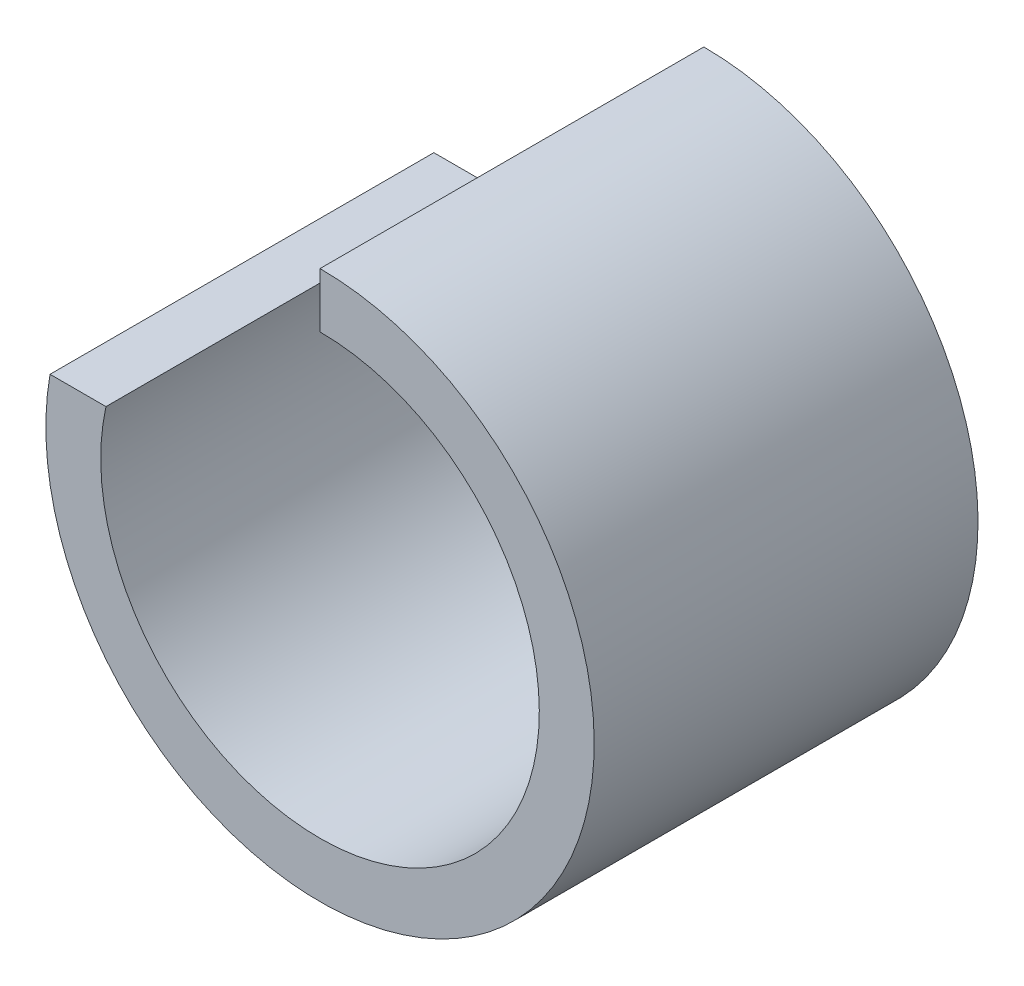
ISO-10303-21;
HEADER;
FILE_DESCRIPTION(('STEP AP214'),'2;1');
FILE_NAME('part.step','',(''),(''),'','','');
FILE_SCHEMA(('AUTOMOTIVE_DESIGN { 1 0 10303 214 1 1 1 1 }'));
ENDSEC;
DATA;
#1=APPLICATION_CONTEXT('core data for automotive mechanical design processes');
#2=APPLICATION_PROTOCOL_DEFINITION('international standard','automotive_design',2000,#1);
#3=PRODUCT_CONTEXT('',#1,'mechanical');
#4=PRODUCT('Part','Part','',(#3));
#5=PRODUCT_RELATED_PRODUCT_CATEGORY('part','',(#4));
#6=PRODUCT_DEFINITION_FORMATION('','',#4);
#7=PRODUCT_DEFINITION_CONTEXT('part definition',#1,'design');
#8=PRODUCT_DEFINITION('design','',#6,#7);
#9=PRODUCT_DEFINITION_SHAPE('','',#8);
#10=(LENGTH_UNIT() NAMED_UNIT(*) SI_UNIT(.MILLI.,.METRE.));
#11=(NAMED_UNIT(*) PLANE_ANGLE_UNIT() SI_UNIT($,.RADIAN.));
#12=(NAMED_UNIT(*) SI_UNIT($,.STERADIAN.) SOLID_ANGLE_UNIT());
#13=UNCERTAINTY_MEASURE_WITH_UNIT(LENGTH_MEASURE(1.E-05),#10,'distance_accuracy_value','');
#14=(GEOMETRIC_REPRESENTATION_CONTEXT(3) GLOBAL_UNCERTAINTY_ASSIGNED_CONTEXT((#13)) GLOBAL_UNIT_ASSIGNED_CONTEXT((#10,
#11,#12)) REPRESENTATION_CONTEXT('',''));
#15=CARTESIAN_POINT('',(0.,0.,0.));
#16=DIRECTION('',(0.,0.,1.));
#17=DIRECTION('',(1.,0.,0.));
#18=AXIS2_PLACEMENT_3D('',#15,#16,#17);
#19=CARTESIAN_POINT('',(0.,0.,14.));
#20=DIRECTION('',(0.,0.,-1.));
#21=DIRECTION('',(-1.,0.,0.));
#22=AXIS2_PLACEMENT_3D('',#19,#20,#21);
#23=CYLINDRICAL_SURFACE('',#22,7.99807242904795);
#24=CARTESIAN_POINT('',(0.,0.,0.));
#25=DIRECTION('',(0.,0.,-1.));
#26=DIRECTION('',(1.,0.,0.));
#27=AXIS2_PLACEMENT_3D('',#24,#25,#26);
#28=CIRCLE('',#27,7.99807242904795);
#29=CARTESIAN_POINT('',(0.,7.99807242904795,0.));
#30=VERTEX_POINT('',#29);
#31=CARTESIAN_POINT('',(-7.8072910551351,1.73648177666924,0.));
#32=VERTEX_POINT('',#31);
#33=EDGE_CURVE('E107',#30,#32,#28,.T.);
#34=ORIENTED_EDGE('',*,*,#33,.T.);
#35=DIRECTION('',(0.,0.,-1.));
#36=VECTOR('',#35,1.);
#37=CARTESIAN_POINT('',(-7.8072910551351,1.73648177666924,14.));
#38=LINE('',#37,#36);
#39=CARTESIAN_POINT('',(-7.8072910551351,1.73648177666924,14.));
#40=VERTEX_POINT('',#39);
#41=EDGE_CURVE('E11',#40,#32,#38,.T.);
#42=ORIENTED_EDGE('',*,*,#41,.F.);
#43=CARTESIAN_POINT('',(0.,0.,14.));
#44=DIRECTION('',(0.,0.,-1.));
#45=DIRECTION('',(1.,0.,0.));
#46=AXIS2_PLACEMENT_3D('',#43,#44,#45);
#47=CIRCLE('',#46,7.99807242904795);
#48=CARTESIAN_POINT('',(0.,7.99807242904795,14.));
#49=VERTEX_POINT('',#48);
#50=EDGE_CURVE('E91',#49,#40,#47,.T.);
#51=ORIENTED_EDGE('',*,*,#50,.F.);
#52=DIRECTION('',(0.,0.,-1.));
#53=VECTOR('',#52,1.);
#54=CARTESIAN_POINT('',(0.,7.99807242904795,14.));
#55=LINE('',#54,#53);
#56=EDGE_CURVE('E103',#49,#30,#55,.T.);
#57=ORIENTED_EDGE('',*,*,#56,.T.);
#58=EDGE_LOOP('',(#34,#42,#51,#57));
#59=FACE_BOUND('',#58,.T.);
#60=ADVANCED_FACE('F39',(#59),#23,.F.);
#61=CARTESIAN_POINT('',(-9.84807753012209,1.73648177666924,14.));
#62=DIRECTION('',(0.,-1.,0.));
#63=DIRECTION('',(0.,0.,-1.));
#64=AXIS2_PLACEMENT_3D('',#61,#62,#63);
#65=PLANE('',#64);
#66=DIRECTION('',(-1.,0.,0.));
#67=VECTOR('',#66,1.);
#68=CARTESIAN_POINT('',(-9.84807753012209,1.73648177666924,0.));
#69=LINE('',#68,#67);
#70=CARTESIAN_POINT('',(-9.84807753012209,1.73648177666924,0.));
#71=VERTEX_POINT('',#70);
#72=EDGE_CURVE('E96',#32,#71,#69,.T.);
#73=ORIENTED_EDGE('',*,*,#72,.T.);
#74=DIRECTION('',(0.,0.,-1.));
#75=VECTOR('',#74,1.);
#76=CARTESIAN_POINT('',(-9.84807753012209,1.73648177666924,14.));
#77=LINE('',#76,#75);
#78=CARTESIAN_POINT('',(-9.84807753012209,1.73648177666924,14.));
#79=VERTEX_POINT('',#78);
#80=EDGE_CURVE('E48',#79,#71,#77,.T.);
#81=ORIENTED_EDGE('',*,*,#80,.F.);
#82=DIRECTION('',(-1.,0.,0.));
#83=VECTOR('',#82,1.);
#84=CARTESIAN_POINT('',(-9.84807753012209,1.73648177666924,14.));
#85=LINE('',#84,#83);
#86=EDGE_CURVE('E86',#40,#79,#85,.T.);
#87=ORIENTED_EDGE('',*,*,#86,.F.);
#88=ORIENTED_EDGE('',*,*,#41,.T.);
#89=EDGE_LOOP('',(#73,#81,#87,#88));
#90=FACE_BOUND('',#89,.T.);
#91=ADVANCED_FACE('F95',(#90),#65,.F.);
#92=CARTESIAN_POINT('',(0.,0.,14.));
#93=DIRECTION('',(0.,0.,-1.));
#94=DIRECTION('',(-1.,0.,0.));
#95=AXIS2_PLACEMENT_3D('',#92,#93,#94);
#96=CYLINDRICAL_SURFACE('',#95,10.);
#97=CARTESIAN_POINT('',(0.,0.,0.));
#98=DIRECTION('',(0.,0.,1.));
#99=DIRECTION('',(1.,0.,0.));
#100=AXIS2_PLACEMENT_3D('',#97,#98,#99);
#101=CIRCLE('',#100,10.);
#102=CARTESIAN_POINT('',(0.,10.,0.));
#103=VERTEX_POINT('',#102);
#104=EDGE_CURVE('E73',#71,#103,#101,.T.);
#105=ORIENTED_EDGE('',*,*,#104,.T.);
#106=DIRECTION('',(0.,0.,-1.));
#107=VECTOR('',#106,1.);
#108=CARTESIAN_POINT('',(0.,10.,14.));
#109=LINE('',#108,#107);
#110=CARTESIAN_POINT('',(0.,10.,14.));
#111=VERTEX_POINT('',#110);
#112=EDGE_CURVE('E98',#111,#103,#109,.T.);
#113=ORIENTED_EDGE('',*,*,#112,.F.);
#114=CARTESIAN_POINT('',(0.,0.,14.));
#115=DIRECTION('',(0.,0.,1.));
#116=DIRECTION('',(1.,0.,0.));
#117=AXIS2_PLACEMENT_3D('',#114,#115,#116);
#118=CIRCLE('',#117,10.);
#119=EDGE_CURVE('E89',#79,#111,#118,.T.);
#120=ORIENTED_EDGE('',*,*,#119,.F.);
#121=ORIENTED_EDGE('',*,*,#80,.T.);
#122=EDGE_LOOP('',(#105,#113,#120,#121));
#123=FACE_BOUND('',#122,.T.);
#124=ADVANCED_FACE('F99',(#123),#96,.T.);
#125=CARTESIAN_POINT('',(0.,10.,14.));
#126=DIRECTION('',(1.,0.,0.));
#127=DIRECTION('',(0.,0.,-1.));
#128=AXIS2_PLACEMENT_3D('',#125,#126,#127);
#129=PLANE('',#128);
#130=DIRECTION('',(0.,-1.,0.));
#131=VECTOR('',#130,1.);
#132=CARTESIAN_POINT('',(0.,10.,0.));
#133=LINE('',#132,#131);
#134=EDGE_CURVE('E79',#103,#30,#133,.T.);
#135=ORIENTED_EDGE('',*,*,#134,.T.);
#136=ORIENTED_EDGE('',*,*,#56,.F.);
#137=DIRECTION('',(0.,-1.,0.));
#138=VECTOR('',#137,1.);
#139=CARTESIAN_POINT('',(0.,10.,14.));
#140=LINE('',#139,#138);
#141=EDGE_CURVE('E56',#111,#49,#140,.T.);
#142=ORIENTED_EDGE('',*,*,#141,.F.);
#143=ORIENTED_EDGE('',*,*,#112,.T.);
#144=EDGE_LOOP('',(#135,#136,#142,#143));
#145=FACE_BOUND('',#144,.T.);
#146=ADVANCED_FACE('F120',(#145),#129,.F.);
#147=CARTESIAN_POINT('',(0.,0.,14.));
#148=DIRECTION('',(0.,0.,1.));
#149=DIRECTION('',(1.,0.,0.));
#150=AXIS2_PLACEMENT_3D('',#147,#148,#149);
#151=PLANE('',#150);
#152=ORIENTED_EDGE('',*,*,#50,.T.);
#153=ORIENTED_EDGE('',*,*,#86,.T.);
#154=ORIENTED_EDGE('',*,*,#119,.T.);
#155=ORIENTED_EDGE('',*,*,#141,.T.);
#156=EDGE_LOOP('',(#152,#153,#154,#155));
#157=FACE_BOUND('',#156,.T.);
#158=ADVANCED_FACE('F87',(#157),#151,.T.);
#159=CARTESIAN_POINT('',(0.,0.,0.));
#160=DIRECTION('',(0.,0.,1.));
#161=DIRECTION('',(1.,0.,0.));
#162=AXIS2_PLACEMENT_3D('',#159,#160,#161);
#163=PLANE('',#162);
#164=ORIENTED_EDGE('',*,*,#33,.F.);
#165=ORIENTED_EDGE('',*,*,#134,.F.);
#166=ORIENTED_EDGE('',*,*,#104,.F.);
#167=ORIENTED_EDGE('',*,*,#72,.F.);
#168=EDGE_LOOP('',(#164,#165,#166,#167));
#169=FACE_BOUND('',#168,.T.);
#170=ADVANCED_FACE('F123',(#169),#163,.F.);
#171=CLOSED_SHELL('',(#60,#91,#124,#146,#158,#170));
#172=MANIFOLD_SOLID_BREP('B2',#171);
#173=ADVANCED_BREP_SHAPE_REPRESENTATION('',(#18,#172),#14);
#174=SHAPE_DEFINITION_REPRESENTATION(#9,#173);
ENDSEC;
END-ISO-10303-21;
